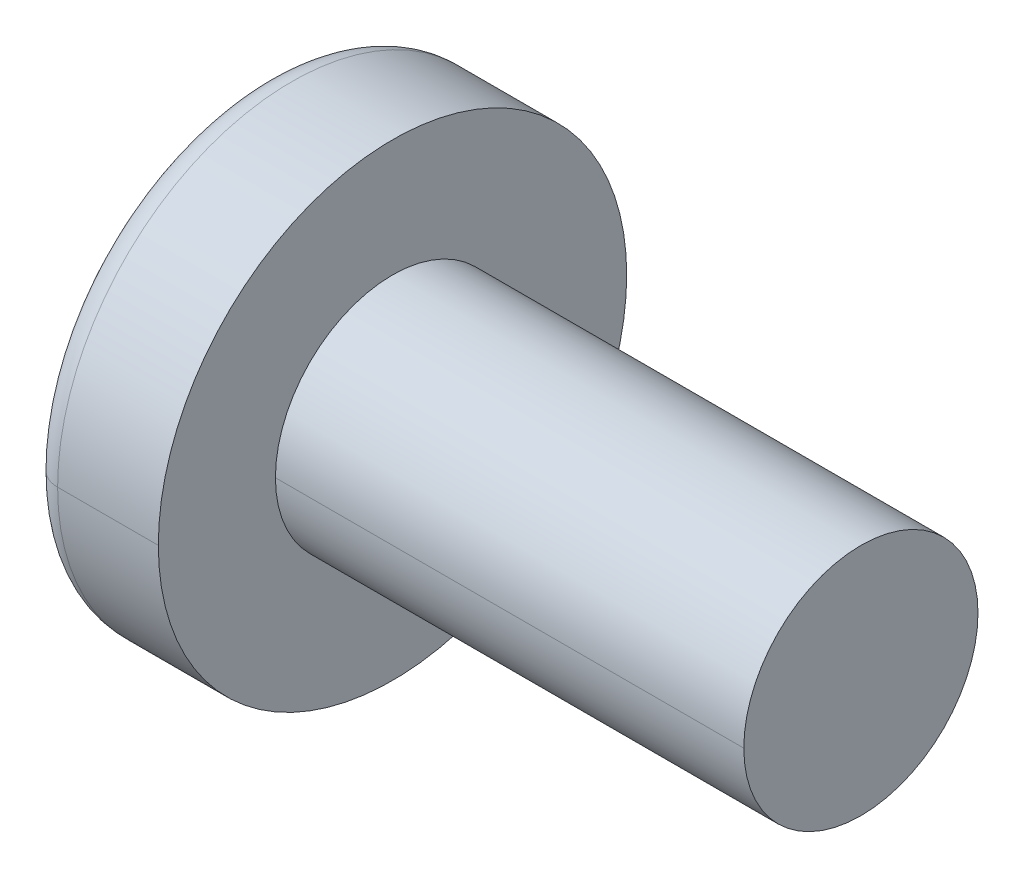
ISO-10303-21;
HEADER;
FILE_DESCRIPTION(('STEP AP214'),'2;1');
FILE_NAME('part.step','',(''),(''),'','','');
FILE_SCHEMA(('AUTOMOTIVE_DESIGN { 1 0 10303 214 1 1 1 1 }'));
ENDSEC;
DATA;
#1=APPLICATION_CONTEXT('core data for automotive mechanical design processes');
#2=APPLICATION_PROTOCOL_DEFINITION('international standard','automotive_design',2000,#1);
#3=PRODUCT_CONTEXT('',#1,'mechanical');
#4=PRODUCT('Part','Part','',(#3));
#5=PRODUCT_RELATED_PRODUCT_CATEGORY('part','',(#4));
#6=PRODUCT_DEFINITION_FORMATION('','',#4);
#7=PRODUCT_DEFINITION_CONTEXT('part definition',#1,'design');
#8=PRODUCT_DEFINITION('design','',#6,#7);
#9=PRODUCT_DEFINITION_SHAPE('','',#8);
#10=(LENGTH_UNIT() NAMED_UNIT(*) SI_UNIT(.MILLI.,.METRE.));
#11=(NAMED_UNIT(*) PLANE_ANGLE_UNIT() SI_UNIT($,.RADIAN.));
#12=(NAMED_UNIT(*) SI_UNIT($,.STERADIAN.) SOLID_ANGLE_UNIT());
#13=UNCERTAINTY_MEASURE_WITH_UNIT(LENGTH_MEASURE(1.E-05),#10,'distance_accuracy_value','');
#14=(GEOMETRIC_REPRESENTATION_CONTEXT(3) GLOBAL_UNCERTAINTY_ASSIGNED_CONTEXT((#13)) GLOBAL_UNIT_ASSIGNED_CONTEXT((#10,
#11,#12)) REPRESENTATION_CONTEXT('',''));
#15=CARTESIAN_POINT('',(0.,0.,0.));
#16=DIRECTION('',(0.,0.,1.));
#17=DIRECTION('',(1.,0.,0.));
#18=AXIS2_PLACEMENT_3D('',#15,#16,#17);
#19=CARTESIAN_POINT('',(1.75982832618026,-0.148712446351931,0.));
#20=DIRECTION('',(-0.11363816050966,0.993522203313031,0.));
#21=DIRECTION('',(0.,0.,1.));
#22=AXIS2_PLACEMENT_3D('',#19,#20,#21);
#23=PLANE('',#22);
#24=CARTESIAN_POINT('',(3.98786118636742,0.106127913473398,0.));
#25=DIRECTION('',(-0.11363816050966,0.993522203313031,0.));
#26=DIRECTION('',(-0.993522203313031,-0.11363816050966,0.));
#27=AXIS2_PLACEMENT_3D('',#24,#25,#26);
#28=CIRCLE('',#27,3.99857343501221);
#29=CARTESIAN_POINT('',(0.0301382525496408,-0.34655281425086,0.346552814250858));
#30=VERTEX_POINT('',#29);
#31=CARTESIAN_POINT('',(0.195539940029893,-0.327634320584821,1.19110847703606));
#32=VERTEX_POINT('',#31);
#33=EDGE_CURVE('E295',#30,#32,#28,.T.);
#34=ORIENTED_EDGE('',*,*,#33,.T.);
#35=DIRECTION('',(0.792336746135061,0.0906267520089144,-0.603315234802187));
#36=VECTOR('',#35,1.);
#37=CARTESIAN_POINT('',(0.,-0.350000000000004,1.34));
#38=LINE('',#37,#36);
#39=CARTESIAN_POINT('',(1.53,-0.175,0.175));
#40=VERTEX_POINT('',#39);
#41=EDGE_CURVE('E11',#32,#40,#38,.T.);
#42=ORIENTED_EDGE('',*,*,#41,.T.);
#43=DIRECTION('',(0.987168682960152,0.112911450665377,-0.112911450665377));
#44=VECTOR('',#43,1.);
#45=CARTESIAN_POINT('',(1.77640420924781,-0.14681651201414,0.146816512014139));
#46=LINE('',#45,#44);
#47=EDGE_CURVE('E318',#30,#40,#46,.T.);
#48=ORIENTED_EDGE('',*,*,#47,.F.);
#49=EDGE_LOOP('',(#34,#42,#48));
#50=FACE_BOUND('',#49,.T.);
#51=ADVANCED_FACE('F17',(#50),#23,.T.);
#52=CARTESIAN_POINT('',(1.75982832618026,0.148712446351931,0.));
#53=DIRECTION('',(-0.11363816050966,-0.993522203313031,0.));
#54=DIRECTION('',(-0.993522203313031,0.11363816050966,0.));
#55=AXIS2_PLACEMENT_3D('',#52,#53,#54);
#56=PLANE('',#55);
#57=CARTESIAN_POINT('',(3.98786118636742,-0.106127913473398,0.));
#58=DIRECTION('',(-0.11363816050966,-0.993522203313031,0.));
#59=DIRECTION('',(0.993522203313031,-0.11363816050966,0.));
#60=AXIS2_PLACEMENT_3D('',#57,#58,#59);
#61=CIRCLE('',#60,3.99857343501221);
#62=CARTESIAN_POINT('',(0.195539940029893,0.327634320584812,1.19110847703606));
#63=VERTEX_POINT('',#62);
#64=CARTESIAN_POINT('',(0.0301382525496408,0.346552814250857,0.346552814250858));
#65=VERTEX_POINT('',#64);
#66=EDGE_CURVE('E287',#63,#65,#61,.T.);
#67=ORIENTED_EDGE('',*,*,#66,.T.);
#68=DIRECTION('',(-0.987168682960152,0.112911450665376,0.112911450665377));
#69=VECTOR('',#68,1.);
#70=CARTESIAN_POINT('',(1.77640420924781,0.146816512014138,0.146816512014139));
#71=LINE('',#70,#69);
#72=CARTESIAN_POINT('',(1.53,0.175,0.175));
#73=VERTEX_POINT('',#72);
#74=EDGE_CURVE('E315',#73,#65,#71,.T.);
#75=ORIENTED_EDGE('',*,*,#74,.F.);
#76=DIRECTION('',(0.792336746135061,-0.0906267520089101,-0.603315234802188));
#77=VECTOR('',#76,1.);
#78=CARTESIAN_POINT('',(0.,0.349999999999995,1.34));
#79=LINE('',#78,#77);
#80=EDGE_CURVE('E25',#63,#73,#79,.T.);
#81=ORIENTED_EDGE('',*,*,#80,.F.);
#82=EDGE_LOOP('',(#67,#75,#81));
#83=FACE_BOUND('',#82,.T.);
#84=ADVANCED_FACE('F399',(#83),#56,.T.);
#85=CARTESIAN_POINT('',(1.53,-0.175,0.175));
#86=DIRECTION('',(0.605808178465614,0.,0.795610740817502));
#87=DIRECTION('',(0.,-1.,0.));
#88=AXIS2_PLACEMENT_3D('',#85,#86,#87);
#89=PLANE('',#88);
#90=ORIENTED_EDGE('',*,*,#80,.T.);
#91=DIRECTION('',(0.,-1.,0.));
#92=VECTOR('',#91,1.);
#93=CARTESIAN_POINT('',(1.53,0.175,0.175));
#94=LINE('',#93,#92);
#95=EDGE_CURVE('E339',#73,#40,#94,.T.);
#96=ORIENTED_EDGE('',*,*,#95,.T.);
#97=ORIENTED_EDGE('',*,*,#41,.F.);
#98=CARTESIAN_POINT('',(3.17784904512422,0.,-1.07973473043772));
#99=DIRECTION('',(0.605808178465614,0.,0.795610740817502));
#100=DIRECTION('',(0.795610740817502,0.,-0.605808178465614));
#101=AXIS2_PLACEMENT_3D('',#98,#99,#100);
#102=CIRCLE('',#101,3.76274377539628);
#103=EDGE_CURVE('E291',#63,#32,#102,.T.);
#104=ORIENTED_EDGE('',*,*,#103,.F.);
#105=EDGE_LOOP('',(#90,#96,#97,#104));
#106=FACE_BOUND('',#105,.T.);
#107=ADVANCED_FACE('F394',(#106),#89,.F.);
#108=CARTESIAN_POINT('',(1.75982832618026,0.148712446351931,0.));
#109=DIRECTION('',(-0.11363816050966,-0.993522203313031,0.));
#110=DIRECTION('',(-0.993522203313031,0.11363816050966,0.));
#111=AXIS2_PLACEMENT_3D('',#108,#109,#110);
#112=PLANE('',#111);
#113=CARTESIAN_POINT('',(3.98786118636742,-0.106127913473398,0.));
#114=DIRECTION('',(-0.11363816050966,-0.993522203313031,0.));
#115=DIRECTION('',(0.993522203313031,-0.11363816050966,0.));
#116=AXIS2_PLACEMENT_3D('',#113,#114,#115);
#117=CIRCLE('',#116,3.99857343501221);
#118=CARTESIAN_POINT('',(0.0301382525496408,0.34655281425086,-0.346552814250858));
#119=VERTEX_POINT('',#118);
#120=CARTESIAN_POINT('',(0.195539940029893,0.327634320584821,-1.19110847703606));
#121=VERTEX_POINT('',#120);
#122=EDGE_CURVE('E260',#119,#121,#117,.T.);
#123=ORIENTED_EDGE('',*,*,#122,.T.);
#124=DIRECTION('',(0.792336746135061,-0.0906267520089144,0.603315234802187));
#125=VECTOR('',#124,1.);
#126=CARTESIAN_POINT('',(0.,0.350000000000004,-1.34));
#127=LINE('',#126,#125);
#128=CARTESIAN_POINT('',(1.53,0.175,-0.175));
#129=VERTEX_POINT('',#128);
#130=EDGE_CURVE('E345',#121,#129,#127,.T.);
#131=ORIENTED_EDGE('',*,*,#130,.T.);
#132=DIRECTION('',(0.987168682960152,-0.112911450665377,0.112911450665377));
#133=VECTOR('',#132,1.);
#134=CARTESIAN_POINT('',(1.77640420924781,0.146816512014139,-0.146816512014139));
#135=LINE('',#134,#133);
#136=EDGE_CURVE('E238',#119,#129,#135,.T.);
#137=ORIENTED_EDGE('',*,*,#136,.F.);
#138=EDGE_LOOP('',(#123,#131,#137));
#139=FACE_BOUND('',#138,.T.);
#140=ADVANCED_FACE('F398',(#139),#112,.T.);
#141=CARTESIAN_POINT('',(1.75982832618026,-0.148712446351931,0.));
#142=DIRECTION('',(-0.11363816050966,0.993522203313031,0.));
#143=DIRECTION('',(0.,0.,1.));
#144=AXIS2_PLACEMENT_3D('',#141,#142,#143);
#145=PLANE('',#144);
#146=CARTESIAN_POINT('',(3.98786118636742,0.106127913473398,0.));
#147=DIRECTION('',(-0.11363816050966,0.993522203313031,0.));
#148=DIRECTION('',(-0.993522203313031,-0.11363816050966,0.));
#149=AXIS2_PLACEMENT_3D('',#146,#147,#148);
#150=CIRCLE('',#149,3.99857343501221);
#151=CARTESIAN_POINT('',(0.195539940029893,-0.327634320584812,-1.19110847703606));
#152=VERTEX_POINT('',#151);
#153=CARTESIAN_POINT('',(0.0301382525496408,-0.346552814250857,-0.346552814250858));
#154=VERTEX_POINT('',#153);
#155=EDGE_CURVE('E226',#152,#154,#150,.T.);
#156=ORIENTED_EDGE('',*,*,#155,.T.);
#157=DIRECTION('',(-0.987168682960152,-0.112911450665376,-0.112911450665377));
#158=VECTOR('',#157,1.);
#159=CARTESIAN_POINT('',(1.77640420924781,-0.146816512014138,-0.146816512014139));
#160=LINE('',#159,#158);
#161=CARTESIAN_POINT('',(1.53,-0.175,-0.175));
#162=VERTEX_POINT('',#161);
#163=EDGE_CURVE('E308',#162,#154,#160,.T.);
#164=ORIENTED_EDGE('',*,*,#163,.F.);
#165=DIRECTION('',(0.792336746135061,0.09062675200891,0.603315234802188));
#166=VECTOR('',#165,1.);
#167=CARTESIAN_POINT('',(0.,-0.349999999999995,-1.34));
#168=LINE('',#167,#166);
#169=EDGE_CURVE('E342',#152,#162,#168,.T.);
#170=ORIENTED_EDGE('',*,*,#169,.F.);
#171=EDGE_LOOP('',(#156,#164,#170));
#172=FACE_BOUND('',#171,.T.);
#173=ADVANCED_FACE('F495',(#172),#145,.T.);
#174=CARTESIAN_POINT('',(1.53,0.175,-0.175));
#175=DIRECTION('',(0.605808178465614,0.,-0.795610740817502));
#176=DIRECTION('',(0.,-1.,0.));
#177=AXIS2_PLACEMENT_3D('',#174,#175,#176);
#178=PLANE('',#177);
#179=ORIENTED_EDGE('',*,*,#169,.T.);
#180=DIRECTION('',(0.,1.,0.));
#181=VECTOR('',#180,1.);
#182=CARTESIAN_POINT('',(1.53,-0.175,-0.175));
#183=LINE('',#182,#181);
#184=EDGE_CURVE('E335',#162,#129,#183,.T.);
#185=ORIENTED_EDGE('',*,*,#184,.T.);
#186=ORIENTED_EDGE('',*,*,#130,.F.);
#187=CARTESIAN_POINT('',(3.17784904512422,0.,1.07973473043772));
#188=DIRECTION('',(0.605808178465614,0.,-0.795610740817502));
#189=DIRECTION('',(-0.795610740817502,0.,-0.605808178465614));
#190=AXIS2_PLACEMENT_3D('',#187,#188,#189);
#191=CIRCLE('',#190,3.76274377539628);
#192=EDGE_CURVE('E208',#152,#121,#191,.T.);
#193=ORIENTED_EDGE('',*,*,#192,.F.);
#194=EDGE_LOOP('',(#179,#185,#186,#193));
#195=FACE_BOUND('',#194,.T.);
#196=ADVANCED_FACE('F490',(#195),#178,.F.);
#197=CARTESIAN_POINT('',(1.53,-0.175,-0.175));
#198=DIRECTION('',(1.,0.,0.));
#199=DIRECTION('',(0.,1.,0.));
#200=AXIS2_PLACEMENT_3D('',#197,#198,#199);
#201=PLANE('',#200);
#202=ORIENTED_EDGE('',*,*,#184,.F.);
#203=DIRECTION('',(0.,0.,1.));
#204=VECTOR('',#203,1.);
#205=CARTESIAN_POINT('',(1.53,-0.175,-0.175));
#206=LINE('',#205,#204);
#207=EDGE_CURVE('E331',#162,#40,#206,.T.);
#208=ORIENTED_EDGE('',*,*,#207,.T.);
#209=ORIENTED_EDGE('',*,*,#95,.F.);
#210=DIRECTION('',(0.,0.,-1.));
#211=VECTOR('',#210,1.);
#212=CARTESIAN_POINT('',(1.53,0.175,0.175));
#213=LINE('',#212,#211);
#214=EDGE_CURVE('E173',#73,#129,#213,.T.);
#215=ORIENTED_EDGE('',*,*,#214,.T.);
#216=EDGE_LOOP('',(#202,#208,#209,#215));
#217=FACE_BOUND('',#216,.T.);
#218=ADVANCED_FACE('F494',(#217),#201,.F.);
#219=CARTESIAN_POINT('',(1.53,-0.175,-0.175));
#220=DIRECTION('',(0.605808178465614,-0.795610740817502,0.));
#221=DIRECTION('',(0.,0.,-1.));
#222=AXIS2_PLACEMENT_3D('',#219,#220,#221);
#223=PLANE('',#222);
#224=DIRECTION('',(0.792336746135061,0.603315234802187,-0.0906267520089121));
#225=VECTOR('',#224,1.);
#226=CARTESIAN_POINT('',(0.,-1.34,0.35));
#227=LINE('',#226,#225);
#228=CARTESIAN_POINT('',(0.195539940029893,-1.19110847703606,0.327634320584816));
#229=VERTEX_POINT('',#228);
#230=EDGE_CURVE('E322',#229,#40,#227,.T.);
#231=ORIENTED_EDGE('',*,*,#230,.T.);
#232=ORIENTED_EDGE('',*,*,#207,.F.);
#233=DIRECTION('',(0.792336746135061,0.603315234802187,0.0906267520089122));
#234=VECTOR('',#233,1.);
#235=CARTESIAN_POINT('',(0.,-1.34,-0.35));
#236=LINE('',#235,#234);
#237=CARTESIAN_POINT('',(0.195539940029893,-1.19110847703606,-0.327634320584817));
#238=VERTEX_POINT('',#237);
#239=EDGE_CURVE('E237',#238,#162,#236,.T.);
#240=ORIENTED_EDGE('',*,*,#239,.F.);
#241=CARTESIAN_POINT('',(3.17784904512422,1.07973473043772,0.));
#242=DIRECTION('',(0.605808178465614,-0.795610740817502,0.));
#243=DIRECTION('',(0.795610740817502,0.605808178465614,0.));
#244=AXIS2_PLACEMENT_3D('',#241,#242,#243);
#245=CIRCLE('',#244,3.76274377539628);
#246=CARTESIAN_POINT('',(0.184169682474743,-1.19976622216792,0.));
#247=VERTEX_POINT('',#246);
#248=EDGE_CURVE('E227',#247,#238,#245,.T.);
#249=ORIENTED_EDGE('',*,*,#248,.F.);
#250=CARTESIAN_POINT('',(3.17784904512422,1.07973473043772,0.));
#251=DIRECTION('',(0.605808178465614,-0.795610740817502,0.));
#252=DIRECTION('',(0.795610740817502,0.605808178465614,0.));
#253=AXIS2_PLACEMENT_3D('',#250,#251,#252);
#254=CIRCLE('',#253,3.76274377539628);
#255=EDGE_CURVE('E302',#229,#247,#254,.T.);
#256=ORIENTED_EDGE('',*,*,#255,.F.);
#257=EDGE_LOOP('',(#231,#232,#240,#249,#256));
#258=FACE_BOUND('',#257,.T.);
#259=ADVANCED_FACE('F419',(#258),#223,.F.);
#260=CARTESIAN_POINT('',(1.53,0.175,0.175));
#261=DIRECTION('',(0.605808178465614,0.795610740817502,0.));
#262=DIRECTION('',(0.,0.,-1.));
#263=AXIS2_PLACEMENT_3D('',#260,#261,#262);
#264=PLANE('',#263);
#265=DIRECTION('',(0.792336746135061,-0.603315234802187,0.0906267520089122));
#266=VECTOR('',#265,1.);
#267=CARTESIAN_POINT('',(0.,1.34,-0.35));
#268=LINE('',#267,#266);
#269=CARTESIAN_POINT('',(0.195539940029893,1.19110847703606,-0.327634320584817));
#270=VERTEX_POINT('',#269);
#271=EDGE_CURVE('E233',#270,#129,#268,.T.);
#272=ORIENTED_EDGE('',*,*,#271,.T.);
#273=ORIENTED_EDGE('',*,*,#214,.F.);
#274=DIRECTION('',(0.792336746135061,-0.603315234802188,-0.0906267520089123));
#275=VECTOR('',#274,1.);
#276=CARTESIAN_POINT('',(0.,1.34,0.35));
#277=LINE('',#276,#275);
#278=CARTESIAN_POINT('',(0.195539940029893,1.19110847703606,0.327634320584817));
#279=VERTEX_POINT('',#278);
#280=EDGE_CURVE('E311',#279,#73,#277,.T.);
#281=ORIENTED_EDGE('',*,*,#280,.F.);
#282=CARTESIAN_POINT('',(3.17784904512422,-1.07973473043772,0.));
#283=DIRECTION('',(0.605808178465614,0.795610740817502,0.));
#284=DIRECTION('',(-0.795610740817502,0.605808178465614,0.));
#285=AXIS2_PLACEMENT_3D('',#282,#283,#284);
#286=CIRCLE('',#285,3.76274377539628);
#287=CARTESIAN_POINT('',(0.184169682474743,1.19976622216792,0.));
#288=VERTEX_POINT('',#287);
#289=EDGE_CURVE('E279',#288,#279,#286,.T.);
#290=ORIENTED_EDGE('',*,*,#289,.F.);
#291=CARTESIAN_POINT('',(3.17784904512422,-1.07973473043772,0.));
#292=DIRECTION('',(0.605808178465614,0.795610740817502,0.));
#293=DIRECTION('',(-0.795610740817502,0.605808178465614,0.));
#294=AXIS2_PLACEMENT_3D('',#291,#292,#293);
#295=CIRCLE('',#294,3.76274377539628);
#296=EDGE_CURVE('E268',#270,#288,#295,.T.);
#297=ORIENTED_EDGE('',*,*,#296,.F.);
#298=EDGE_LOOP('',(#272,#273,#281,#290,#297));
#299=FACE_BOUND('',#298,.T.);
#300=ADVANCED_FACE('F414',(#299),#264,.F.);
#301=CARTESIAN_POINT('',(7.1,1.25,0.));
#302=DIRECTION('',(1.,0.,0.));
#303=DIRECTION('',(0.,1.,0.));
#304=AXIS2_PLACEMENT_3D('',#301,#302,#303);
#305=PLANE('',#304);
#306=CARTESIAN_POINT('',(7.1,0.,0.));
#307=DIRECTION('',(-1.,0.,0.));
#308=DIRECTION('',(0.,0.,1.));
#309=AXIS2_PLACEMENT_3D('',#306,#307,#308);
#310=CIRCLE('',#309,1.25);
#311=CARTESIAN_POINT('',(7.1,0.,1.25));
#312=VERTEX_POINT('',#311);
#313=CARTESIAN_POINT('',(7.1,0.,-1.25));
#314=VERTEX_POINT('',#313);
#315=EDGE_CURVE('E184',#312,#314,#310,.T.);
#316=ORIENTED_EDGE('',*,*,#315,.F.);
#317=CARTESIAN_POINT('',(7.1,0.,0.));
#318=DIRECTION('',(-1.,0.,0.));
#319=DIRECTION('',(0.,0.,1.));
#320=AXIS2_PLACEMENT_3D('',#317,#318,#319);
#321=CIRCLE('',#320,1.25);
#322=EDGE_CURVE('E214',#314,#312,#321,.T.);
#323=ORIENTED_EDGE('',*,*,#322,.F.);
#324=EDGE_LOOP('',(#316,#323));
#325=FACE_BOUND('',#324,.T.);
#326=ADVANCED_FACE('F418',(#325),#305,.T.);
#327=CARTESIAN_POINT('',(1.0251050438713,0.,0.));
#328=DIRECTION('',(-1.,0.,0.));
#329=DIRECTION('',(0.,0.,1.));
#330=AXIS2_PLACEMENT_3D('',#327,#328,#329);
#331=TOROIDAL_SURFACE('',#330,2.2,0.3);
#332=CARTESIAN_POINT('',(1.0251050438713,0.,-2.2));
#333=DIRECTION('',(0.,1.,0.));
#334=DIRECTION('',(0.,0.,1.));
#335=AXIS2_PLACEMENT_3D('',#332,#333,#334);
#336=CIRCLE('',#335,0.3);
#337=CARTESIAN_POINT('',(1.0251050438713,0.,-2.5));
#338=VERTEX_POINT('',#337);
#339=CARTESIAN_POINT('',(0.783897344725726,0.,-2.37837837837838));
#340=VERTEX_POINT('',#339);
#341=EDGE_CURVE('E167',#338,#340,#336,.T.);
#342=ORIENTED_EDGE('',*,*,#341,.F.);
#343=CARTESIAN_POINT('',(1.0251050438713,0.,0.));
#344=DIRECTION('',(-1.,0.,0.));
#345=DIRECTION('',(0.,0.,1.));
#346=AXIS2_PLACEMENT_3D('',#343,#344,#345);
#347=CIRCLE('',#346,2.5);
#348=CARTESIAN_POINT('',(1.0251050438713,0.,2.5));
#349=VERTEX_POINT('',#348);
#350=EDGE_CURVE('E160',#338,#349,#347,.T.);
#351=ORIENTED_EDGE('',*,*,#350,.T.);
#352=CARTESIAN_POINT('',(1.0251050438713,0.,2.2));
#353=DIRECTION('',(0.,-1.,0.));
#354=DIRECTION('',(0.,0.,-1.));
#355=AXIS2_PLACEMENT_3D('',#352,#353,#354);
#356=CIRCLE('',#355,0.3);
#357=CARTESIAN_POINT('',(0.783897344725726,0.,2.37837837837838));
#358=VERTEX_POINT('',#357);
#359=EDGE_CURVE('E164',#349,#358,#356,.T.);
#360=ORIENTED_EDGE('',*,*,#359,.T.);
#361=CARTESIAN_POINT('',(0.783897344725726,0.,0.));
#362=DIRECTION('',(-1.,0.,0.));
#363=DIRECTION('',(0.,0.,1.));
#364=AXIS2_PLACEMENT_3D('',#361,#362,#363);
#365=CIRCLE('',#364,2.37837837837838);
#366=CARTESIAN_POINT('',(0.783897344725726,-2.37837837837838,0.));
#367=VERTEX_POINT('',#366);
#368=EDGE_CURVE('E276',#367,#358,#365,.T.);
#369=ORIENTED_EDGE('',*,*,#368,.F.);
#370=CARTESIAN_POINT('',(0.783897344725726,0.,0.));
#371=DIRECTION('',(-1.,0.,0.));
#372=DIRECTION('',(0.,0.,1.));
#373=AXIS2_PLACEMENT_3D('',#370,#371,#372);
#374=CIRCLE('',#373,2.37837837837838);
#375=EDGE_CURVE('E232',#340,#367,#374,.T.);
#376=ORIENTED_EDGE('',*,*,#375,.F.);
#377=EDGE_LOOP('',(#342,#351,#360,#369,#376));
#378=FACE_BOUND('',#377,.T.);
#379=ADVANCED_FACE('F162',(#378),#331,.T.);
#380=CARTESIAN_POINT('',(-25.4,0.,0.));
#381=DIRECTION('',(-1.,0.,0.));
#382=DIRECTION('',(0.,0.,1.));
#383=AXIS2_PLACEMENT_3D('',#380,#381,#382);
#384=CYLINDRICAL_SURFACE('',#383,2.5);
#385=DIRECTION('',(-1.,0.,0.));
#386=VECTOR('',#385,1.);
#387=CARTESIAN_POINT('',(-25.4,0.,-2.5));
#388=LINE('',#387,#386);
#389=CARTESIAN_POINT('',(2.1,0.,-2.5));
#390=VERTEX_POINT('',#389);
#391=EDGE_CURVE('E185',#390,#338,#388,.T.);
#392=ORIENTED_EDGE('',*,*,#391,.F.);
#393=CARTESIAN_POINT('',(2.1,0.,0.));
#394=DIRECTION('',(-1.,0.,0.));
#395=DIRECTION('',(0.,0.,1.));
#396=AXIS2_PLACEMENT_3D('',#393,#394,#395);
#397=CIRCLE('',#396,2.5);
#398=CARTESIAN_POINT('',(2.1,0.,2.5));
#399=VERTEX_POINT('',#398);
#400=EDGE_CURVE('E174',#390,#399,#397,.T.);
#401=ORIENTED_EDGE('',*,*,#400,.T.);
#402=DIRECTION('',(-1.,0.,0.));
#403=VECTOR('',#402,1.);
#404=CARTESIAN_POINT('',(-25.4,0.,2.5));
#405=LINE('',#404,#403);
#406=EDGE_CURVE('E177',#399,#349,#405,.T.);
#407=ORIENTED_EDGE('',*,*,#406,.T.);
#408=ORIENTED_EDGE('',*,*,#350,.F.);
#409=EDGE_LOOP('',(#392,#401,#407,#408));
#410=FACE_BOUND('',#409,.T.);
#411=ADVANCED_FACE('F178',(#410),#384,.T.);
#412=CARTESIAN_POINT('',(2.1,1.25,0.));
#413=DIRECTION('',(-1.,0.,0.));
#414=DIRECTION('',(0.,0.,1.));
#415=AXIS2_PLACEMENT_3D('',#412,#413,#414);
#416=PLANE('',#415);
#417=CARTESIAN_POINT('',(2.1,0.,0.));
#418=DIRECTION('',(-1.,0.,0.));
#419=DIRECTION('',(0.,0.,1.));
#420=AXIS2_PLACEMENT_3D('',#417,#418,#419);
#421=CIRCLE('',#420,1.25);
#422=CARTESIAN_POINT('',(2.1,0.,1.25));
#423=VERTEX_POINT('',#422);
#424=CARTESIAN_POINT('',(2.1,0.,-1.25));
#425=VERTEX_POINT('',#424);
#426=EDGE_CURVE('E218',#423,#425,#421,.T.);
#427=ORIENTED_EDGE('',*,*,#426,.T.);
#428=CARTESIAN_POINT('',(2.1,0.,0.));
#429=DIRECTION('',(-1.,0.,0.));
#430=DIRECTION('',(0.,0.,1.));
#431=AXIS2_PLACEMENT_3D('',#428,#429,#430);
#432=CIRCLE('',#431,1.25);
#433=EDGE_CURVE('E210',#425,#423,#432,.T.);
#434=ORIENTED_EDGE('',*,*,#433,.T.);
#435=EDGE_LOOP('',(#427,#434));
#436=FACE_BOUND('',#435,.T.);
#437=CARTESIAN_POINT('',(2.1,0.,0.));
#438=DIRECTION('',(-1.,0.,0.));
#439=DIRECTION('',(0.,0.,1.));
#440=AXIS2_PLACEMENT_3D('',#437,#438,#439);
#441=CIRCLE('',#440,2.5);
#442=EDGE_CURVE('E194',#399,#390,#441,.T.);
#443=ORIENTED_EDGE('',*,*,#442,.F.);
#444=ORIENTED_EDGE('',*,*,#400,.F.);
#445=EDGE_LOOP('',(#443,#444));
#446=FACE_BOUND('',#445,.T.);
#447=ADVANCED_FACE('F429',(#436,#446),#416,.F.);
#448=CARTESIAN_POINT('',(-25.4,0.,0.));
#449=DIRECTION('',(-1.,0.,0.));
#450=DIRECTION('',(0.,0.,1.));
#451=AXIS2_PLACEMENT_3D('',#448,#449,#450);
#452=CYLINDRICAL_SURFACE('',#451,1.25);
#453=DIRECTION('',(-1.,0.,0.));
#454=VECTOR('',#453,1.);
#455=CARTESIAN_POINT('',(-25.4,0.,-1.25));
#456=LINE('',#455,#454);
#457=EDGE_CURVE('E215',#314,#425,#456,.T.);
#458=ORIENTED_EDGE('',*,*,#457,.F.);
#459=ORIENTED_EDGE('',*,*,#322,.T.);
#460=DIRECTION('',(-1.,0.,0.));
#461=VECTOR('',#460,1.);
#462=CARTESIAN_POINT('',(-25.4,0.,1.25));
#463=LINE('',#462,#461);
#464=EDGE_CURVE('E244',#312,#423,#463,.T.);
#465=ORIENTED_EDGE('',*,*,#464,.T.);
#466=ORIENTED_EDGE('',*,*,#433,.F.);
#467=EDGE_LOOP('',(#458,#459,#465,#466));
#468=FACE_BOUND('',#467,.T.);
#469=ADVANCED_FACE('F376',(#468),#452,.T.);
#470=CARTESIAN_POINT('',(1.75982832618026,0.,0.148712446351931));
#471=DIRECTION('',(-0.11363816050966,0.,-0.993522203313031));
#472=DIRECTION('',(-0.993522203313031,0.,0.11363816050966));
#473=AXIS2_PLACEMENT_3D('',#470,#471,#472);
#474=PLANE('',#473);
#475=CARTESIAN_POINT('',(3.98786118636742,0.,-0.106127913473398));
#476=DIRECTION('',(-0.11363816050966,0.,-0.993522203313031));
#477=DIRECTION('',(-0.993522203313031,0.,0.11363816050966));
#478=AXIS2_PLACEMENT_3D('',#475,#476,#477);
#479=CIRCLE('',#478,3.99857343501221);
#480=EDGE_CURVE('E298',#229,#30,#479,.T.);
#481=ORIENTED_EDGE('',*,*,#480,.T.);
#482=ORIENTED_EDGE('',*,*,#47,.T.);
#483=ORIENTED_EDGE('',*,*,#230,.F.);
#484=EDGE_LOOP('',(#481,#482,#483));
#485=FACE_BOUND('',#484,.T.);
#486=ADVANCED_FACE('F371',(#485),#474,.T.);
#487=CARTESIAN_POINT('',(1.75982832618026,0.,0.148712446351931));
#488=DIRECTION('',(-0.11363816050966,0.,-0.993522203313031));
#489=DIRECTION('',(-0.993522203313031,0.,0.11363816050966));
#490=AXIS2_PLACEMENT_3D('',#487,#488,#489);
#491=PLANE('',#490);
#492=ORIENTED_EDGE('',*,*,#280,.T.);
#493=ORIENTED_EDGE('',*,*,#74,.T.);
#494=CARTESIAN_POINT('',(3.98786118636742,0.,-0.106127913473398));
#495=DIRECTION('',(-0.11363816050966,0.,-0.993522203313031));
#496=DIRECTION('',(-0.993522203313031,0.,0.11363816050966));
#497=AXIS2_PLACEMENT_3D('',#494,#495,#496);
#498=CIRCLE('',#497,3.99857343501221);
#499=EDGE_CURVE('E283',#65,#279,#498,.T.);
#500=ORIENTED_EDGE('',*,*,#499,.T.);
#501=EDGE_LOOP('',(#492,#493,#500));
#502=FACE_BOUND('',#501,.T.);
#503=ADVANCED_FACE('F375',(#502),#491,.T.);
#504=CARTESIAN_POINT('',(1.75982832618026,0.,-0.148712446351931));
#505=DIRECTION('',(-0.11363816050966,0.,0.993522203313031));
#506=DIRECTION('',(0.,1.,0.));
#507=AXIS2_PLACEMENT_3D('',#504,#505,#506);
#508=PLANE('',#507);
#509=ORIENTED_EDGE('',*,*,#239,.T.);
#510=ORIENTED_EDGE('',*,*,#163,.T.);
#511=CARTESIAN_POINT('',(3.98786118636742,0.,0.106127913473398));
#512=DIRECTION('',(-0.11363816050966,0.,0.993522203313031));
#513=DIRECTION('',(0.993522203313031,0.,0.11363816050966));
#514=AXIS2_PLACEMENT_3D('',#511,#512,#513);
#515=CIRCLE('',#514,3.99857343501221);
#516=EDGE_CURVE('E222',#154,#238,#515,.T.);
#517=ORIENTED_EDGE('',*,*,#516,.T.);
#518=EDGE_LOOP('',(#509,#510,#517));
#519=FACE_BOUND('',#518,.T.);
#520=ADVANCED_FACE('F383',(#519),#508,.T.);
#521=CARTESIAN_POINT('',(1.75982832618026,0.,-0.148712446351931));
#522=DIRECTION('',(-0.11363816050966,0.,0.993522203313031));
#523=DIRECTION('',(0.,1.,0.));
#524=AXIS2_PLACEMENT_3D('',#521,#522,#523);
#525=PLANE('',#524);
#526=CARTESIAN_POINT('',(3.98786118636742,0.,0.106127913473398));
#527=DIRECTION('',(-0.11363816050966,0.,0.993522203313031));
#528=DIRECTION('',(0.993522203313031,0.,0.11363816050966));
#529=AXIS2_PLACEMENT_3D('',#526,#527,#528);
#530=CIRCLE('',#529,3.99857343501221);
#531=EDGE_CURVE('E264',#270,#119,#530,.T.);
#532=ORIENTED_EDGE('',*,*,#531,.T.);
#533=ORIENTED_EDGE('',*,*,#136,.T.);
#534=ORIENTED_EDGE('',*,*,#271,.F.);
#535=EDGE_LOOP('',(#532,#533,#534));
#536=FACE_BOUND('',#535,.T.);
#537=ADVANCED_FACE('F387',(#536),#525,.T.);
#538=CARTESIAN_POINT('',(4.,0.,0.));
#539=DIRECTION('',(0.,0.,-1.));
#540=DIRECTION('',(0.,1.,0.));
#541=AXIS2_PLACEMENT_3D('',#538,#539,#540);
#542=SPHERICAL_SURFACE('',#541,4.);
#543=CARTESIAN_POINT('',(4.,0.,0.));
#544=DIRECTION('',(0.,0.,-1.));
#545=DIRECTION('',(0.,1.,0.));
#546=AXIS2_PLACEMENT_3D('',#543,#544,#545);
#547=CIRCLE('',#546,4.);
#548=EDGE_CURVE('E228',#367,#247,#547,.T.);
#549=ORIENTED_EDGE('',*,*,#548,.F.);
#550=ORIENTED_EDGE('',*,*,#368,.T.);
#551=CARTESIAN_POINT('',(0.783897344725726,0.,0.));
#552=DIRECTION('',(-1.,0.,0.));
#553=DIRECTION('',(0.,0.,1.));
#554=AXIS2_PLACEMENT_3D('',#551,#552,#553);
#555=CIRCLE('',#554,2.37837837837838);
#556=CARTESIAN_POINT('',(0.783897344725726,2.37837837837838,0.));
#557=VERTEX_POINT('',#556);
#558=EDGE_CURVE('E192',#358,#557,#555,.T.);
#559=ORIENTED_EDGE('',*,*,#558,.T.);
#560=CARTESIAN_POINT('',(4.,0.,0.));
#561=DIRECTION('',(0.,0.,1.));
#562=DIRECTION('',(1.,0.,0.));
#563=AXIS2_PLACEMENT_3D('',#560,#561,#562);
#564=CIRCLE('',#563,4.);
#565=EDGE_CURVE('E272',#557,#288,#564,.T.);
#566=ORIENTED_EDGE('',*,*,#565,.T.);
#567=ORIENTED_EDGE('',*,*,#289,.T.);
#568=ORIENTED_EDGE('',*,*,#499,.F.);
#569=ORIENTED_EDGE('',*,*,#66,.F.);
#570=ORIENTED_EDGE('',*,*,#103,.T.);
#571=ORIENTED_EDGE('',*,*,#33,.F.);
#572=ORIENTED_EDGE('',*,*,#480,.F.);
#573=ORIENTED_EDGE('',*,*,#255,.T.);
#574=EDGE_LOOP('',(#549,#550,#559,#566,#567,#568,#569,#570,#571,#572,#573));
#575=FACE_BOUND('',#574,.T.);
#576=ADVANCED_FACE('F457',(#575),#542,.T.);
#577=CARTESIAN_POINT('',(4.,0.,0.));
#578=DIRECTION('',(0.,0.,-1.));
#579=DIRECTION('',(0.,1.,0.));
#580=AXIS2_PLACEMENT_3D('',#577,#578,#579);
#581=SPHERICAL_SURFACE('',#580,4.);
#582=CARTESIAN_POINT('',(0.783897344725726,0.,0.));
#583=DIRECTION('',(-1.,0.,0.));
#584=DIRECTION('',(0.,0.,1.));
#585=AXIS2_PLACEMENT_3D('',#582,#583,#584);
#586=CIRCLE('',#585,2.37837837837838);
#587=EDGE_CURVE('E204',#557,#340,#586,.T.);
#588=ORIENTED_EDGE('',*,*,#587,.T.);
#589=ORIENTED_EDGE('',*,*,#375,.T.);
#590=ORIENTED_EDGE('',*,*,#548,.T.);
#591=ORIENTED_EDGE('',*,*,#248,.T.);
#592=ORIENTED_EDGE('',*,*,#516,.F.);
#593=ORIENTED_EDGE('',*,*,#155,.F.);
#594=ORIENTED_EDGE('',*,*,#192,.T.);
#595=ORIENTED_EDGE('',*,*,#122,.F.);
#596=ORIENTED_EDGE('',*,*,#531,.F.);
#597=ORIENTED_EDGE('',*,*,#296,.T.);
#598=ORIENTED_EDGE('',*,*,#565,.F.);
#599=EDGE_LOOP('',(#588,#589,#590,#591,#592,#593,#594,#595,#596,#597,#598));
#600=FACE_BOUND('',#599,.T.);
#601=ADVANCED_FACE('F439',(#600),#581,.T.);
#602=CARTESIAN_POINT('',(-25.4,0.,0.));
#603=DIRECTION('',(-1.,0.,0.));
#604=DIRECTION('',(0.,0.,1.));
#605=AXIS2_PLACEMENT_3D('',#602,#603,#604);
#606=CYLINDRICAL_SURFACE('',#605,1.25);
#607=ORIENTED_EDGE('',*,*,#315,.T.);
#608=ORIENTED_EDGE('',*,*,#457,.T.);
#609=ORIENTED_EDGE('',*,*,#426,.F.);
#610=ORIENTED_EDGE('',*,*,#464,.F.);
#611=EDGE_LOOP('',(#607,#608,#609,#610));
#612=FACE_BOUND('',#611,.T.);
#613=ADVANCED_FACE('F408',(#612),#606,.T.);
#614=CARTESIAN_POINT('',(-25.4,0.,0.));
#615=DIRECTION('',(-1.,0.,0.));
#616=DIRECTION('',(0.,0.,1.));
#617=AXIS2_PLACEMENT_3D('',#614,#615,#616);
#618=CYLINDRICAL_SURFACE('',#617,2.5);
#619=ORIENTED_EDGE('',*,*,#442,.T.);
#620=ORIENTED_EDGE('',*,*,#391,.T.);
#621=CARTESIAN_POINT('',(1.0251050438713,0.,0.));
#622=DIRECTION('',(-1.,0.,0.));
#623=DIRECTION('',(0.,0.,1.));
#624=AXIS2_PLACEMENT_3D('',#621,#622,#623);
#625=CIRCLE('',#624,2.5);
#626=EDGE_CURVE('E189',#349,#338,#625,.T.);
#627=ORIENTED_EDGE('',*,*,#626,.F.);
#628=ORIENTED_EDGE('',*,*,#406,.F.);
#629=EDGE_LOOP('',(#619,#620,#627,#628));
#630=FACE_BOUND('',#629,.T.);
#631=ADVANCED_FACE('F196',(#630),#618,.T.);
#632=CARTESIAN_POINT('',(1.0251050438713,0.,0.));
#633=DIRECTION('',(-1.,0.,0.));
#634=DIRECTION('',(0.,0.,1.));
#635=AXIS2_PLACEMENT_3D('',#632,#633,#634);
#636=TOROIDAL_SURFACE('',#635,2.2,0.3);
#637=ORIENTED_EDGE('',*,*,#626,.T.);
#638=ORIENTED_EDGE('',*,*,#341,.T.);
#639=ORIENTED_EDGE('',*,*,#587,.F.);
#640=ORIENTED_EDGE('',*,*,#558,.F.);
#641=ORIENTED_EDGE('',*,*,#359,.F.);
#642=EDGE_LOOP('',(#637,#638,#639,#640,#641));
#643=FACE_BOUND('',#642,.T.);
#644=ADVANCED_FACE('F188',(#643),#636,.T.);
#645=CLOSED_SHELL('',(#51,#84,#107,#140,#173,#196,#218,#259,#300,#326,#379,#411,#447,#469,#486,
#503,#520,#537,#576,#601,#613,#631,#644));
#646=MANIFOLD_SOLID_BREP('B1',#645);
#647=ADVANCED_BREP_SHAPE_REPRESENTATION('',(#18,#646),#14);
#648=SHAPE_DEFINITION_REPRESENTATION(#9,#647);
ENDSEC;
END-ISO-10303-21;
